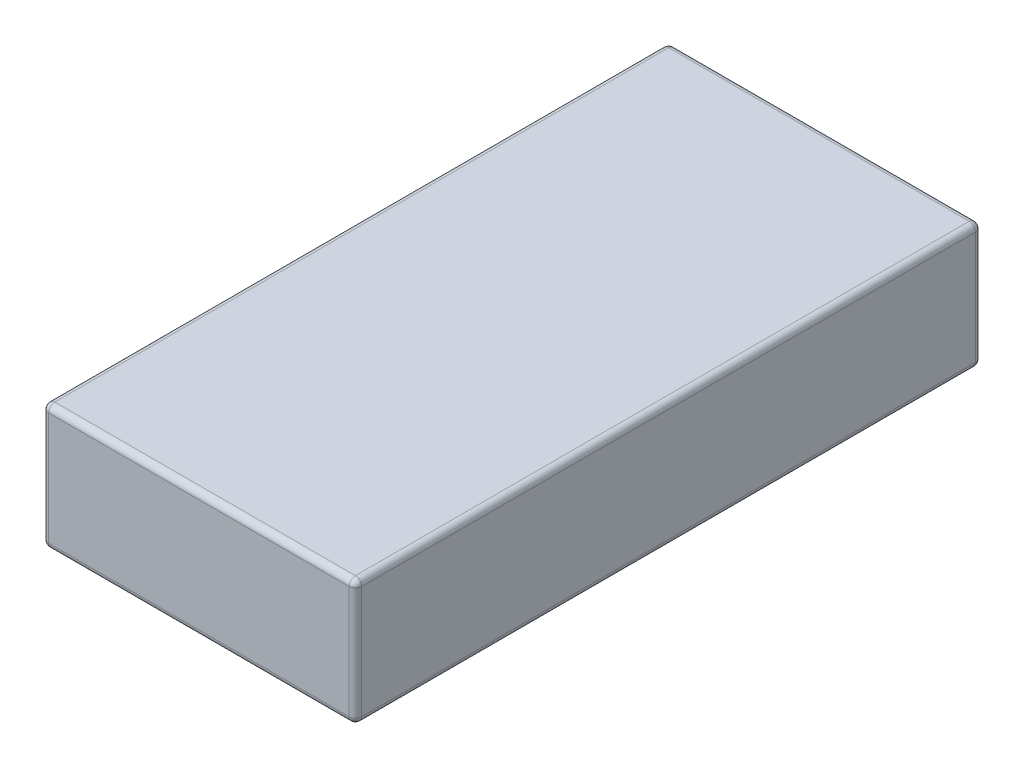
ISO-10303-21;
HEADER;
FILE_DESCRIPTION(('STEP AP214'),'2;1');
FILE_NAME('part.step','',(''),(''),'','','');
FILE_SCHEMA(('AUTOMOTIVE_DESIGN { 1 0 10303 214 1 1 1 1 }'));
ENDSEC;
DATA;
#1=APPLICATION_CONTEXT('core data for automotive mechanical design processes');
#2=APPLICATION_PROTOCOL_DEFINITION('international standard','automotive_design',2000,#1);
#3=PRODUCT_CONTEXT('',#1,'mechanical');
#4=PRODUCT('Part','Part','',(#3));
#5=PRODUCT_RELATED_PRODUCT_CATEGORY('part','',(#4));
#6=PRODUCT_DEFINITION_FORMATION('','',#4);
#7=PRODUCT_DEFINITION_CONTEXT('part definition',#1,'design');
#8=PRODUCT_DEFINITION('design','',#6,#7);
#9=PRODUCT_DEFINITION_SHAPE('','',#8);
#10=(LENGTH_UNIT() NAMED_UNIT(*) SI_UNIT(.MILLI.,.METRE.));
#11=(NAMED_UNIT(*) PLANE_ANGLE_UNIT() SI_UNIT($,.RADIAN.));
#12=(NAMED_UNIT(*) SI_UNIT($,.STERADIAN.) SOLID_ANGLE_UNIT());
#13=UNCERTAINTY_MEASURE_WITH_UNIT(LENGTH_MEASURE(1.E-05),#10,'distance_accuracy_value','');
#14=(GEOMETRIC_REPRESENTATION_CONTEXT(3) GLOBAL_UNCERTAINTY_ASSIGNED_CONTEXT((#13)) GLOBAL_UNIT_ASSIGNED_CONTEXT((#10,
#11,#12)) REPRESENTATION_CONTEXT('',''));
#15=CARTESIAN_POINT('',(0.,0.,0.));
#16=DIRECTION('',(0.,0.,1.));
#17=DIRECTION('',(1.,0.,0.));
#18=AXIS2_PLACEMENT_3D('',#15,#16,#17);
#19=CARTESIAN_POINT('',(2.5,2.,-5.));
#20=DIRECTION('',(-1.,0.,0.));
#21=DIRECTION('',(0.,0.,1.));
#22=AXIS2_PLACEMENT_3D('',#19,#20,#21);
#23=PLANE('',#22);
#24=DIRECTION('',(0.,-1.,0.));
#25=VECTOR('',#24,1.);
#26=CARTESIAN_POINT('',(2.5,2.,4.9));
#27=LINE('',#26,#25);
#28=CARTESIAN_POINT('',(2.5,1.9,4.9));
#29=VERTEX_POINT('',#28);
#30=CARTESIAN_POINT('',(2.5,0.1,4.9));
#31=VERTEX_POINT('',#30);
#32=EDGE_CURVE('E148',#29,#31,#27,.T.);
#33=ORIENTED_EDGE('',*,*,#32,.T.);
#34=DIRECTION('',(0.,0.,-1.));
#35=VECTOR('',#34,1.);
#36=CARTESIAN_POINT('',(2.5,0.1,-5.));
#37=LINE('',#36,#35);
#38=CARTESIAN_POINT('',(2.5,0.1,-4.9));
#39=VERTEX_POINT('',#38);
#40=EDGE_CURVE('E144',#31,#39,#37,.T.);
#41=ORIENTED_EDGE('',*,*,#40,.T.);
#42=DIRECTION('',(0.,-1.,0.));
#43=VECTOR('',#42,1.);
#44=CARTESIAN_POINT('',(2.5,2.,-4.9));
#45=LINE('',#44,#43);
#46=CARTESIAN_POINT('',(2.5,1.9,-4.9));
#47=VERTEX_POINT('',#46);
#48=EDGE_CURVE('E139',#39,#47,#45,.F.);
#49=ORIENTED_EDGE('',*,*,#48,.T.);
#50=DIRECTION('',(0.,0.,-1.));
#51=VECTOR('',#50,1.);
#52=CARTESIAN_POINT('',(2.5,1.9,5.));
#53=LINE('',#52,#51);
#54=EDGE_CURVE('E141',#47,#29,#53,.F.);
#55=ORIENTED_EDGE('',*,*,#54,.T.);
#56=EDGE_LOOP('',(#33,#41,#49,#55));
#57=FACE_BOUND('',#56,.T.);
#58=ADVANCED_FACE('F51',(#57),#23,.F.);
#59=CARTESIAN_POINT('',(-2.5,2.,-5.));
#60=DIRECTION('',(0.,0.,1.));
#61=DIRECTION('',(1.,0.,0.));
#62=AXIS2_PLACEMENT_3D('',#59,#60,#61);
#63=PLANE('',#62);
#64=DIRECTION('',(-1.,0.,0.));
#65=VECTOR('',#64,1.);
#66=CARTESIAN_POINT('',(2.5,1.9,-5.));
#67=LINE('',#66,#65);
#68=CARTESIAN_POINT('',(-2.4,1.9,-5.));
#69=VERTEX_POINT('',#68);
#70=CARTESIAN_POINT('',(2.4,1.9,-5.));
#71=VERTEX_POINT('',#70);
#72=EDGE_CURVE('E282',#69,#71,#67,.F.);
#73=ORIENTED_EDGE('',*,*,#72,.T.);
#74=DIRECTION('',(0.,-1.,0.));
#75=VECTOR('',#74,1.);
#76=CARTESIAN_POINT('',(2.4,2.,-5.));
#77=LINE('',#76,#75);
#78=CARTESIAN_POINT('',(2.4,0.1,-5.));
#79=VERTEX_POINT('',#78);
#80=EDGE_CURVE('E170',#71,#79,#77,.T.);
#81=ORIENTED_EDGE('',*,*,#80,.T.);
#82=DIRECTION('',(-1.,0.,0.));
#83=VECTOR('',#82,1.);
#84=CARTESIAN_POINT('',(-2.5,0.1,-5.));
#85=LINE('',#84,#83);
#86=CARTESIAN_POINT('',(-2.4,0.1,-5.));
#87=VERTEX_POINT('',#86);
#88=EDGE_CURVE('E290',#79,#87,#85,.T.);
#89=ORIENTED_EDGE('',*,*,#88,.T.);
#90=DIRECTION('',(0.,-1.,0.));
#91=VECTOR('',#90,1.);
#92=CARTESIAN_POINT('',(-2.4,2.,-5.));
#93=LINE('',#92,#91);
#94=EDGE_CURVE('E284',#87,#69,#93,.F.);
#95=ORIENTED_EDGE('',*,*,#94,.T.);
#96=EDGE_LOOP('',(#73,#81,#89,#95));
#97=FACE_BOUND('',#96,.T.);
#98=ADVANCED_FACE('F326',(#97),#63,.F.);
#99=CARTESIAN_POINT('',(-2.5,2.,-5.));
#100=DIRECTION('',(1.,0.,0.));
#101=DIRECTION('',(0.,0.,-1.));
#102=AXIS2_PLACEMENT_3D('',#99,#100,#101);
#103=PLANE('',#102);
#104=DIRECTION('',(0.,0.,1.));
#105=VECTOR('',#104,1.);
#106=CARTESIAN_POINT('',(-2.5,1.9,-5.));
#107=LINE('',#106,#105);
#108=CARTESIAN_POINT('',(-2.5,1.9,4.9));
#109=VERTEX_POINT('',#108);
#110=CARTESIAN_POINT('',(-2.5,1.9,-4.9));
#111=VERTEX_POINT('',#110);
#112=EDGE_CURVE('E293',#109,#111,#107,.F.);
#113=ORIENTED_EDGE('',*,*,#112,.T.);
#114=DIRECTION('',(0.,-1.,0.));
#115=VECTOR('',#114,1.);
#116=CARTESIAN_POINT('',(-2.5,2.,-4.9));
#117=LINE('',#116,#115);
#118=CARTESIAN_POINT('',(-2.5,0.1,-4.9));
#119=VERTEX_POINT('',#118);
#120=EDGE_CURVE('E298',#111,#119,#117,.T.);
#121=ORIENTED_EDGE('',*,*,#120,.T.);
#122=DIRECTION('',(0.,0.,1.));
#123=VECTOR('',#122,1.);
#124=CARTESIAN_POINT('',(-2.5,0.1,-5.));
#125=LINE('',#124,#123);
#126=CARTESIAN_POINT('',(-2.5,0.1,4.9));
#127=VERTEX_POINT('',#126);
#128=EDGE_CURVE('E296',#119,#127,#125,.T.);
#129=ORIENTED_EDGE('',*,*,#128,.T.);
#130=DIRECTION('',(0.,-1.,0.));
#131=VECTOR('',#130,1.);
#132=CARTESIAN_POINT('',(-2.5,2.,4.9));
#133=LINE('',#132,#131);
#134=EDGE_CURVE('E230',#127,#109,#133,.F.);
#135=ORIENTED_EDGE('',*,*,#134,.T.);
#136=EDGE_LOOP('',(#113,#121,#129,#135));
#137=FACE_BOUND('',#136,.T.);
#138=ADVANCED_FACE('F318',(#137),#103,.F.);
#139=CARTESIAN_POINT('',(-2.5,2.,5.));
#140=DIRECTION('',(0.,0.,-1.));
#141=DIRECTION('',(-1.,0.,0.));
#142=AXIS2_PLACEMENT_3D('',#139,#140,#141);
#143=PLANE('',#142);
#144=DIRECTION('',(0.,-1.,0.));
#145=VECTOR('',#144,1.);
#146=CARTESIAN_POINT('',(-2.4,2.,5.));
#147=LINE('',#146,#145);
#148=CARTESIAN_POINT('',(-2.4,1.9,5.));
#149=VERTEX_POINT('',#148);
#150=CARTESIAN_POINT('',(-2.4,0.1,5.));
#151=VERTEX_POINT('',#150);
#152=EDGE_CURVE('E233',#149,#151,#147,.T.);
#153=ORIENTED_EDGE('',*,*,#152,.T.);
#154=DIRECTION('',(1.,0.,0.));
#155=VECTOR('',#154,1.);
#156=CARTESIAN_POINT('',(-2.5,0.1,5.));
#157=LINE('',#156,#155);
#158=CARTESIAN_POINT('',(2.4,0.1,5.));
#159=VERTEX_POINT('',#158);
#160=EDGE_CURVE('E235',#151,#159,#157,.T.);
#161=ORIENTED_EDGE('',*,*,#160,.T.);
#162=DIRECTION('',(0.,-1.,0.));
#163=VECTOR('',#162,1.);
#164=CARTESIAN_POINT('',(2.4,2.,5.));
#165=LINE('',#164,#163);
#166=CARTESIAN_POINT('',(2.4,1.9,5.));
#167=VERTEX_POINT('',#166);
#168=EDGE_CURVE('E236',#159,#167,#165,.F.);
#169=ORIENTED_EDGE('',*,*,#168,.T.);
#170=DIRECTION('',(1.,0.,0.));
#171=VECTOR('',#170,1.);
#172=CARTESIAN_POINT('',(-2.5,1.9,5.));
#173=LINE('',#172,#171);
#174=EDGE_CURVE('E240',#167,#149,#173,.F.);
#175=ORIENTED_EDGE('',*,*,#174,.T.);
#176=EDGE_LOOP('',(#153,#161,#169,#175));
#177=FACE_BOUND('',#176,.T.);
#178=ADVANCED_FACE('F301',(#177),#143,.F.);
#179=CARTESIAN_POINT('',(0.,2.,0.));
#180=DIRECTION('',(0.,1.,0.));
#181=DIRECTION('',(0.,0.,1.));
#182=AXIS2_PLACEMENT_3D('',#179,#180,#181);
#183=PLANE('',#182);
#184=DIRECTION('',(0.,0.,1.));
#185=VECTOR('',#184,1.);
#186=CARTESIAN_POINT('',(-2.4,2.,5.));
#187=LINE('',#186,#185);
#188=CARTESIAN_POINT('',(-2.4,2.,-4.9));
#189=VERTEX_POINT('',#188);
#190=CARTESIAN_POINT('',(-2.4,2.,4.9));
#191=VERTEX_POINT('',#190);
#192=EDGE_CURVE('E60',#189,#191,#187,.T.);
#193=ORIENTED_EDGE('',*,*,#192,.T.);
#194=DIRECTION('',(1.,0.,0.));
#195=VECTOR('',#194,1.);
#196=CARTESIAN_POINT('',(2.5,2.,4.9));
#197=LINE('',#196,#195);
#198=CARTESIAN_POINT('',(2.4,2.,4.9));
#199=VERTEX_POINT('',#198);
#200=EDGE_CURVE('E11',#191,#199,#197,.T.);
#201=ORIENTED_EDGE('',*,*,#200,.T.);
#202=DIRECTION('',(0.,0.,-1.));
#203=VECTOR('',#202,1.);
#204=CARTESIAN_POINT('',(2.4,2.,-5.));
#205=LINE('',#204,#203);
#206=CARTESIAN_POINT('',(2.4,2.,-4.9));
#207=VERTEX_POINT('',#206);
#208=EDGE_CURVE('E238',#199,#207,#205,.T.);
#209=ORIENTED_EDGE('',*,*,#208,.T.);
#210=DIRECTION('',(-1.,0.,0.));
#211=VECTOR('',#210,1.);
#212=CARTESIAN_POINT('',(-2.5,2.,-4.9));
#213=LINE('',#212,#211);
#214=EDGE_CURVE('E71',#207,#189,#213,.T.);
#215=ORIENTED_EDGE('',*,*,#214,.T.);
#216=EDGE_LOOP('',(#193,#201,#209,#215));
#217=FACE_BOUND('',#216,.T.);
#218=ADVANCED_FACE('F306',(#217),#183,.T.);
#219=CARTESIAN_POINT('',(0.,0.,0.));
#220=DIRECTION('',(0.,1.,0.));
#221=DIRECTION('',(0.,0.,1.));
#222=AXIS2_PLACEMENT_3D('',#219,#220,#221);
#223=PLANE('',#222);
#224=DIRECTION('',(-1.,0.,0.));
#225=VECTOR('',#224,1.);
#226=CARTESIAN_POINT('',(0.,0.,-4.9));
#227=LINE('',#226,#225);
#228=CARTESIAN_POINT('',(-2.4,0.,-4.9));
#229=VERTEX_POINT('',#228);
#230=CARTESIAN_POINT('',(2.4,0.,-4.9));
#231=VERTEX_POINT('',#230);
#232=EDGE_CURVE('E278',#229,#231,#227,.F.);
#233=ORIENTED_EDGE('',*,*,#232,.T.);
#234=DIRECTION('',(0.,0.,-1.));
#235=VECTOR('',#234,1.);
#236=CARTESIAN_POINT('',(2.4,0.,0.));
#237=LINE('',#236,#235);
#238=CARTESIAN_POINT('',(2.4,0.,4.9));
#239=VERTEX_POINT('',#238);
#240=EDGE_CURVE('E275',#231,#239,#237,.F.);
#241=ORIENTED_EDGE('',*,*,#240,.T.);
#242=DIRECTION('',(1.,0.,0.));
#243=VECTOR('',#242,1.);
#244=CARTESIAN_POINT('',(0.,0.,4.9));
#245=LINE('',#244,#243);
#246=CARTESIAN_POINT('',(-2.4,0.,4.9));
#247=VERTEX_POINT('',#246);
#248=EDGE_CURVE('E266',#239,#247,#245,.F.);
#249=ORIENTED_EDGE('',*,*,#248,.T.);
#250=DIRECTION('',(0.,0.,1.));
#251=VECTOR('',#250,1.);
#252=CARTESIAN_POINT('',(-2.4,0.,0.));
#253=LINE('',#252,#251);
#254=EDGE_CURVE('E272',#247,#229,#253,.F.);
#255=ORIENTED_EDGE('',*,*,#254,.T.);
#256=EDGE_LOOP('',(#233,#241,#249,#255));
#257=FACE_BOUND('',#256,.T.);
#258=ADVANCED_FACE('F276',(#257),#223,.F.);
#259=CARTESIAN_POINT('',(-2.4,1.9,0.));
#260=DIRECTION('',(0.,0.,-1.));
#261=DIRECTION('',(-1.,0.,0.));
#262=AXIS2_PLACEMENT_3D('',#259,#260,#261);
#263=CYLINDRICAL_SURFACE('',#262,0.1);
#264=CARTESIAN_POINT('',(-2.4,1.9,4.9));
#265=DIRECTION('',(0.,0.,1.));
#266=DIRECTION('',(1.,0.,0.));
#267=AXIS2_PLACEMENT_3D('',#264,#265,#266);
#268=CIRCLE('',#267,0.1);
#269=EDGE_CURVE('E55',#191,#109,#268,.T.);
#270=ORIENTED_EDGE('',*,*,#269,.F.);
#271=ORIENTED_EDGE('',*,*,#192,.F.);
#272=CARTESIAN_POINT('',(-2.4,1.9,-4.9));
#273=DIRECTION('',(0.,0.,-1.));
#274=DIRECTION('',(-1.,0.,0.));
#275=AXIS2_PLACEMENT_3D('',#272,#273,#274);
#276=CIRCLE('',#275,0.1);
#277=EDGE_CURVE('E211',#111,#189,#276,.T.);
#278=ORIENTED_EDGE('',*,*,#277,.F.);
#279=ORIENTED_EDGE('',*,*,#112,.F.);
#280=EDGE_LOOP('',(#270,#271,#278,#279));
#281=FACE_BOUND('',#280,.T.);
#282=ADVANCED_FACE('F53',(#281),#263,.T.);
#283=CARTESIAN_POINT('',(-2.4,1.9,4.9));
#284=DIRECTION('',(-1.,0.,0.));
#285=DIRECTION('',(0.,0.,1.));
#286=AXIS2_PLACEMENT_3D('',#283,#284,#285);
#287=SPHERICAL_SURFACE('',#286,0.1);
#288=CARTESIAN_POINT('',(-2.4,1.9,4.9));
#289=DIRECTION('',(-1.,0.,0.));
#290=DIRECTION('',(0.,0.,1.));
#291=AXIS2_PLACEMENT_3D('',#288,#289,#290);
#292=CIRCLE('',#291,0.1);
#293=EDGE_CURVE('E206',#191,#149,#292,.F.);
#294=ORIENTED_EDGE('',*,*,#293,.F.);
#295=ORIENTED_EDGE('',*,*,#269,.T.);
#296=CARTESIAN_POINT('',(-2.4,1.9,4.9));
#297=DIRECTION('',(0.,1.,0.));
#298=DIRECTION('',(0.,0.,1.));
#299=AXIS2_PLACEMENT_3D('',#296,#297,#298);
#300=CIRCLE('',#299,0.1);
#301=EDGE_CURVE('E209',#149,#109,#300,.F.);
#302=ORIENTED_EDGE('',*,*,#301,.F.);
#303=EDGE_LOOP('',(#294,#295,#302));
#304=FACE_BOUND('',#303,.T.);
#305=ADVANCED_FACE('F221',(#304),#287,.T.);
#306=CARTESIAN_POINT('',(-2.4,1.9,-4.9));
#307=DIRECTION('',(0.,1.,0.));
#308=DIRECTION('',(0.,0.,1.));
#309=AXIS2_PLACEMENT_3D('',#306,#307,#308);
#310=SPHERICAL_SURFACE('',#309,0.1);
#311=CARTESIAN_POINT('',(-2.4,1.9,-4.9));
#312=DIRECTION('',(0.,1.,0.));
#313=DIRECTION('',(0.,0.,1.));
#314=AXIS2_PLACEMENT_3D('',#311,#312,#313);
#315=CIRCLE('',#314,0.1);
#316=EDGE_CURVE('E200',#111,#69,#315,.F.);
#317=ORIENTED_EDGE('',*,*,#316,.F.);
#318=ORIENTED_EDGE('',*,*,#277,.T.);
#319=CARTESIAN_POINT('',(-2.4,1.9,-4.9));
#320=DIRECTION('',(-1.,0.,0.));
#321=DIRECTION('',(0.,0.,1.));
#322=AXIS2_PLACEMENT_3D('',#319,#320,#321);
#323=CIRCLE('',#322,0.1);
#324=EDGE_CURVE('E203',#69,#189,#323,.F.);
#325=ORIENTED_EDGE('',*,*,#324,.F.);
#326=EDGE_LOOP('',(#317,#318,#325));
#327=FACE_BOUND('',#326,.T.);
#328=ADVANCED_FACE('F310',(#327),#310,.T.);
#329=CARTESIAN_POINT('',(-2.4,2.,4.9));
#330=DIRECTION('',(0.,-1.,0.));
#331=DIRECTION('',(0.,0.,-1.));
#332=AXIS2_PLACEMENT_3D('',#329,#330,#331);
#333=CYLINDRICAL_SURFACE('',#332,0.1);
#334=ORIENTED_EDGE('',*,*,#301,.T.);
#335=ORIENTED_EDGE('',*,*,#134,.F.);
#336=CARTESIAN_POINT('',(-2.4,0.1,4.9));
#337=DIRECTION('',(0.,-1.,0.));
#338=DIRECTION('',(0.,0.,-1.));
#339=AXIS2_PLACEMENT_3D('',#336,#337,#338);
#340=CIRCLE('',#339,0.1);
#341=EDGE_CURVE('E194',#151,#127,#340,.T.);
#342=ORIENTED_EDGE('',*,*,#341,.F.);
#343=ORIENTED_EDGE('',*,*,#152,.F.);
#344=EDGE_LOOP('',(#334,#335,#342,#343));
#345=FACE_BOUND('',#344,.T.);
#346=ADVANCED_FACE('F228',(#345),#333,.T.);
#347=CARTESIAN_POINT('',(0.,1.9,4.9));
#348=DIRECTION('',(-1.,0.,0.));
#349=DIRECTION('',(0.,0.,1.));
#350=AXIS2_PLACEMENT_3D('',#347,#348,#349);
#351=CYLINDRICAL_SURFACE('',#350,0.1);
#352=ORIENTED_EDGE('',*,*,#293,.T.);
#353=ORIENTED_EDGE('',*,*,#174,.F.);
#354=CARTESIAN_POINT('',(2.4,1.9,4.9));
#355=DIRECTION('',(1.,0.,0.));
#356=DIRECTION('',(0.,0.,-1.));
#357=AXIS2_PLACEMENT_3D('',#354,#355,#356);
#358=CIRCLE('',#357,0.1);
#359=EDGE_CURVE('E191',#199,#167,#358,.T.);
#360=ORIENTED_EDGE('',*,*,#359,.F.);
#361=ORIENTED_EDGE('',*,*,#200,.F.);
#362=EDGE_LOOP('',(#352,#353,#360,#361));
#363=FACE_BOUND('',#362,.T.);
#364=ADVANCED_FACE('F305',(#363),#351,.T.);
#365=CARTESIAN_POINT('',(2.4,1.9,0.));
#366=DIRECTION('',(0.,0.,1.));
#367=DIRECTION('',(1.,0.,0.));
#368=AXIS2_PLACEMENT_3D('',#365,#366,#367);
#369=CYLINDRICAL_SURFACE('',#368,0.1);
#370=CARTESIAN_POINT('',(2.4,1.9,-4.9));
#371=DIRECTION('',(0.,0.,-1.));
#372=DIRECTION('',(-1.,0.,0.));
#373=AXIS2_PLACEMENT_3D('',#370,#371,#372);
#374=CIRCLE('',#373,0.1);
#375=EDGE_CURVE('E155',#207,#47,#374,.T.);
#376=ORIENTED_EDGE('',*,*,#375,.F.);
#377=ORIENTED_EDGE('',*,*,#208,.F.);
#378=CARTESIAN_POINT('',(2.4,1.9,4.9));
#379=DIRECTION('',(0.,0.,1.));
#380=DIRECTION('',(0.,-1.,0.));
#381=AXIS2_PLACEMENT_3D('',#378,#379,#380);
#382=CIRCLE('',#381,0.1);
#383=EDGE_CURVE('E157',#29,#199,#382,.T.);
#384=ORIENTED_EDGE('',*,*,#383,.F.);
#385=ORIENTED_EDGE('',*,*,#54,.F.);
#386=EDGE_LOOP('',(#376,#377,#384,#385));
#387=FACE_BOUND('',#386,.T.);
#388=ADVANCED_FACE('F153',(#387),#369,.T.);
#389=CARTESIAN_POINT('',(0.,1.9,-4.9));
#390=DIRECTION('',(1.,0.,0.));
#391=DIRECTION('',(0.,0.,-1.));
#392=AXIS2_PLACEMENT_3D('',#389,#390,#391);
#393=CYLINDRICAL_SURFACE('',#392,0.1);
#394=ORIENTED_EDGE('',*,*,#324,.T.);
#395=ORIENTED_EDGE('',*,*,#214,.F.);
#396=CARTESIAN_POINT('',(2.4,1.9,-4.9));
#397=DIRECTION('',(1.,0.,0.));
#398=DIRECTION('',(0.,1.,0.));
#399=AXIS2_PLACEMENT_3D('',#396,#397,#398);
#400=CIRCLE('',#399,0.1);
#401=EDGE_CURVE('E166',#71,#207,#400,.T.);
#402=ORIENTED_EDGE('',*,*,#401,.F.);
#403=ORIENTED_EDGE('',*,*,#72,.F.);
#404=EDGE_LOOP('',(#394,#395,#402,#403));
#405=FACE_BOUND('',#404,.T.);
#406=ADVANCED_FACE('F308',(#405),#393,.T.);
#407=CARTESIAN_POINT('',(-2.4,2.,-4.9));
#408=DIRECTION('',(0.,-1.,0.));
#409=DIRECTION('',(0.,0.,-1.));
#410=AXIS2_PLACEMENT_3D('',#407,#408,#409);
#411=CYLINDRICAL_SURFACE('',#410,0.1);
#412=ORIENTED_EDGE('',*,*,#316,.T.);
#413=ORIENTED_EDGE('',*,*,#94,.F.);
#414=CARTESIAN_POINT('',(-2.4,0.1,-4.9));
#415=DIRECTION('',(0.,-1.,0.));
#416=DIRECTION('',(0.,0.,-1.));
#417=AXIS2_PLACEMENT_3D('',#414,#415,#416);
#418=CIRCLE('',#417,0.1);
#419=EDGE_CURVE('E186',#119,#87,#418,.T.);
#420=ORIENTED_EDGE('',*,*,#419,.F.);
#421=ORIENTED_EDGE('',*,*,#120,.F.);
#422=EDGE_LOOP('',(#412,#413,#420,#421));
#423=FACE_BOUND('',#422,.T.);
#424=ADVANCED_FACE('F315',(#423),#411,.T.);
#425=CARTESIAN_POINT('',(-2.4,0.1,-5.));
#426=DIRECTION('',(0.,0.,1.));
#427=DIRECTION('',(1.,0.,0.));
#428=AXIS2_PLACEMENT_3D('',#425,#426,#427);
#429=CYLINDRICAL_SURFACE('',#428,0.1);
#430=CARTESIAN_POINT('',(-2.4,0.1,4.9));
#431=DIRECTION('',(0.,0.,1.));
#432=DIRECTION('',(1.,0.,0.));
#433=AXIS2_PLACEMENT_3D('',#430,#431,#432);
#434=CIRCLE('',#433,0.1);
#435=EDGE_CURVE('E197',#127,#247,#434,.T.);
#436=ORIENTED_EDGE('',*,*,#435,.F.);
#437=ORIENTED_EDGE('',*,*,#128,.F.);
#438=CARTESIAN_POINT('',(-2.4,0.1,-4.9));
#439=DIRECTION('',(0.,0.,-1.));
#440=DIRECTION('',(-1.,0.,0.));
#441=AXIS2_PLACEMENT_3D('',#438,#439,#440);
#442=CIRCLE('',#441,0.1);
#443=EDGE_CURVE('E184',#229,#119,#442,.T.);
#444=ORIENTED_EDGE('',*,*,#443,.F.);
#445=ORIENTED_EDGE('',*,*,#254,.F.);
#446=EDGE_LOOP('',(#436,#437,#444,#445));
#447=FACE_BOUND('',#446,.T.);
#448=ADVANCED_FACE('F369',(#447),#429,.T.);
#449=CARTESIAN_POINT('',(-2.4,0.1,4.9));
#450=DIRECTION('',(-1.,0.,0.));
#451=DIRECTION('',(0.,-1.,0.));
#452=AXIS2_PLACEMENT_3D('',#449,#450,#451);
#453=SPHERICAL_SURFACE('',#452,0.1);
#454=ORIENTED_EDGE('',*,*,#341,.T.);
#455=ORIENTED_EDGE('',*,*,#435,.T.);
#456=CARTESIAN_POINT('',(-2.4,0.1,4.9));
#457=DIRECTION('',(-1.,0.,0.));
#458=DIRECTION('',(0.,0.,1.));
#459=AXIS2_PLACEMENT_3D('',#456,#457,#458);
#460=CIRCLE('',#459,0.1);
#461=EDGE_CURVE('E175',#151,#247,#460,.F.);
#462=ORIENTED_EDGE('',*,*,#461,.F.);
#463=EDGE_LOOP('',(#454,#455,#462));
#464=FACE_BOUND('',#463,.T.);
#465=ADVANCED_FACE('F365',(#464),#453,.T.);
#466=CARTESIAN_POINT('',(2.4,1.9,4.9));
#467=DIRECTION('',(0.,1.,0.));
#468=DIRECTION('',(0.,0.,1.));
#469=AXIS2_PLACEMENT_3D('',#466,#467,#468);
#470=SPHERICAL_SURFACE('',#469,0.1);
#471=ORIENTED_EDGE('',*,*,#383,.T.);
#472=ORIENTED_EDGE('',*,*,#359,.T.);
#473=CARTESIAN_POINT('',(2.4,1.9,4.9));
#474=DIRECTION('',(0.,1.,0.));
#475=DIRECTION('',(0.,0.,1.));
#476=AXIS2_PLACEMENT_3D('',#473,#474,#475);
#477=CIRCLE('',#476,0.1);
#478=EDGE_CURVE('E171',#29,#167,#477,.F.);
#479=ORIENTED_EDGE('',*,*,#478,.F.);
#480=EDGE_LOOP('',(#471,#472,#479));
#481=FACE_BOUND('',#480,.T.);
#482=ADVANCED_FACE('F362',(#481),#470,.T.);
#483=CARTESIAN_POINT('',(2.4,1.9,-4.9));
#484=DIRECTION('',(0.,1.,0.));
#485=DIRECTION('',(0.,0.,1.));
#486=AXIS2_PLACEMENT_3D('',#483,#484,#485);
#487=SPHERICAL_SURFACE('',#486,0.1);
#488=ORIENTED_EDGE('',*,*,#401,.T.);
#489=ORIENTED_EDGE('',*,*,#375,.T.);
#490=CARTESIAN_POINT('',(2.4,1.9,-4.9));
#491=DIRECTION('',(0.,1.,0.));
#492=DIRECTION('',(0.,0.,1.));
#493=AXIS2_PLACEMENT_3D('',#490,#491,#492);
#494=CIRCLE('',#493,0.1);
#495=EDGE_CURVE('E163',#71,#47,#494,.F.);
#496=ORIENTED_EDGE('',*,*,#495,.F.);
#497=EDGE_LOOP('',(#488,#489,#496));
#498=FACE_BOUND('',#497,.T.);
#499=ADVANCED_FACE('F162',(#498),#487,.T.);
#500=CARTESIAN_POINT('',(-2.4,0.1,-4.9));
#501=DIRECTION('',(-1.,0.,0.));
#502=DIRECTION('',(0.,-1.,0.));
#503=AXIS2_PLACEMENT_3D('',#500,#501,#502);
#504=SPHERICAL_SURFACE('',#503,0.1);
#505=ORIENTED_EDGE('',*,*,#443,.T.);
#506=ORIENTED_EDGE('',*,*,#419,.T.);
#507=CARTESIAN_POINT('',(-2.4,0.1,-4.9));
#508=DIRECTION('',(-1.,0.,0.));
#509=DIRECTION('',(0.,0.,1.));
#510=AXIS2_PLACEMENT_3D('',#507,#508,#509);
#511=CIRCLE('',#510,0.1);
#512=EDGE_CURVE('E172',#229,#87,#511,.F.);
#513=ORIENTED_EDGE('',*,*,#512,.F.);
#514=EDGE_LOOP('',(#505,#506,#513));
#515=FACE_BOUND('',#514,.T.);
#516=ADVANCED_FACE('F356',(#515),#504,.T.);
#517=CARTESIAN_POINT('',(-2.5,0.1,4.9));
#518=DIRECTION('',(1.,0.,0.));
#519=DIRECTION('',(0.,0.,-1.));
#520=AXIS2_PLACEMENT_3D('',#517,#518,#519);
#521=CYLINDRICAL_SURFACE('',#520,0.1);
#522=ORIENTED_EDGE('',*,*,#461,.T.);
#523=ORIENTED_EDGE('',*,*,#248,.F.);
#524=CARTESIAN_POINT('',(2.4,0.1,4.9));
#525=DIRECTION('',(1.,0.,0.));
#526=DIRECTION('',(0.,0.,-1.));
#527=AXIS2_PLACEMENT_3D('',#524,#525,#526);
#528=CIRCLE('',#527,0.1);
#529=EDGE_CURVE('E178',#159,#239,#528,.T.);
#530=ORIENTED_EDGE('',*,*,#529,.F.);
#531=ORIENTED_EDGE('',*,*,#160,.F.);
#532=EDGE_LOOP('',(#522,#523,#530,#531));
#533=FACE_BOUND('',#532,.T.);
#534=ADVANCED_FACE('F268',(#533),#521,.T.);
#535=CARTESIAN_POINT('',(2.4,2.,4.9));
#536=DIRECTION('',(0.,-1.,0.));
#537=DIRECTION('',(0.,0.,-1.));
#538=AXIS2_PLACEMENT_3D('',#535,#536,#537);
#539=CYLINDRICAL_SURFACE('',#538,0.1);
#540=ORIENTED_EDGE('',*,*,#478,.T.);
#541=ORIENTED_EDGE('',*,*,#168,.F.);
#542=CARTESIAN_POINT('',(2.4,0.1,4.9));
#543=DIRECTION('',(0.,-1.,0.));
#544=DIRECTION('',(0.,0.,-1.));
#545=AXIS2_PLACEMENT_3D('',#542,#543,#544);
#546=CIRCLE('',#545,0.1);
#547=EDGE_CURVE('E256',#31,#159,#546,.T.);
#548=ORIENTED_EDGE('',*,*,#547,.F.);
#549=ORIENTED_EDGE('',*,*,#32,.F.);
#550=EDGE_LOOP('',(#540,#541,#548,#549));
#551=FACE_BOUND('',#550,.T.);
#552=ADVANCED_FACE('F350',(#551),#539,.T.);
#553=CARTESIAN_POINT('',(2.4,2.,-4.9));
#554=DIRECTION('',(0.,-1.,0.));
#555=DIRECTION('',(0.,0.,-1.));
#556=AXIS2_PLACEMENT_3D('',#553,#554,#555);
#557=CYLINDRICAL_SURFACE('',#556,0.1);
#558=ORIENTED_EDGE('',*,*,#495,.T.);
#559=ORIENTED_EDGE('',*,*,#48,.F.);
#560=CARTESIAN_POINT('',(2.4,0.1,-4.9));
#561=DIRECTION('',(0.,-1.,0.));
#562=DIRECTION('',(0.,0.,-1.));
#563=AXIS2_PLACEMENT_3D('',#560,#561,#562);
#564=CIRCLE('',#563,0.1);
#565=EDGE_CURVE('E253',#79,#39,#564,.T.);
#566=ORIENTED_EDGE('',*,*,#565,.F.);
#567=ORIENTED_EDGE('',*,*,#80,.F.);
#568=EDGE_LOOP('',(#558,#559,#566,#567));
#569=FACE_BOUND('',#568,.T.);
#570=ADVANCED_FACE('F168',(#569),#557,.T.);
#571=CARTESIAN_POINT('',(-2.5,0.1,-4.9));
#572=DIRECTION('',(-1.,0.,0.));
#573=DIRECTION('',(0.,0.,1.));
#574=AXIS2_PLACEMENT_3D('',#571,#572,#573);
#575=CYLINDRICAL_SURFACE('',#574,0.1);
#576=ORIENTED_EDGE('',*,*,#512,.T.);
#577=ORIENTED_EDGE('',*,*,#88,.F.);
#578=CARTESIAN_POINT('',(2.4,0.1,-4.9));
#579=DIRECTION('',(1.,0.,0.));
#580=DIRECTION('',(0.,0.,-1.));
#581=AXIS2_PLACEMENT_3D('',#578,#579,#580);
#582=CIRCLE('',#581,0.1);
#583=EDGE_CURVE('E251',#231,#79,#582,.T.);
#584=ORIENTED_EDGE('',*,*,#583,.F.);
#585=ORIENTED_EDGE('',*,*,#232,.F.);
#586=EDGE_LOOP('',(#576,#577,#584,#585));
#587=FACE_BOUND('',#586,.T.);
#588=ADVANCED_FACE('F344',(#587),#575,.T.);
#589=CARTESIAN_POINT('',(2.4,0.1,4.9));
#590=DIRECTION('',(0.,0.,1.));
#591=DIRECTION('',(0.,-1.,0.));
#592=AXIS2_PLACEMENT_3D('',#589,#590,#591);
#593=SPHERICAL_SURFACE('',#592,0.1);
#594=ORIENTED_EDGE('',*,*,#547,.T.);
#595=ORIENTED_EDGE('',*,*,#529,.T.);
#596=CARTESIAN_POINT('',(2.4,0.1,4.9));
#597=DIRECTION('',(0.,0.,1.));
#598=DIRECTION('',(1.,0.,0.));
#599=AXIS2_PLACEMENT_3D('',#596,#597,#598);
#600=CIRCLE('',#599,0.1);
#601=EDGE_CURVE('E249',#31,#239,#600,.F.);
#602=ORIENTED_EDGE('',*,*,#601,.F.);
#603=EDGE_LOOP('',(#594,#595,#602));
#604=FACE_BOUND('',#603,.T.);
#605=ADVANCED_FACE('F263',(#604),#593,.T.);
#606=CARTESIAN_POINT('',(2.4,0.1,-4.9));
#607=DIRECTION('',(0.,0.,-1.));
#608=DIRECTION('',(-1.,0.,0.));
#609=AXIS2_PLACEMENT_3D('',#606,#607,#608);
#610=SPHERICAL_SURFACE('',#609,0.1);
#611=ORIENTED_EDGE('',*,*,#583,.T.);
#612=ORIENTED_EDGE('',*,*,#565,.T.);
#613=CARTESIAN_POINT('',(2.4,0.1,-4.9));
#614=DIRECTION('',(0.,0.,-1.));
#615=DIRECTION('',(-1.,0.,0.));
#616=AXIS2_PLACEMENT_3D('',#613,#614,#615);
#617=CIRCLE('',#616,0.1);
#618=EDGE_CURVE('E247',#231,#39,#617,.F.);
#619=ORIENTED_EDGE('',*,*,#618,.F.);
#620=EDGE_LOOP('',(#611,#612,#619));
#621=FACE_BOUND('',#620,.T.);
#622=ADVANCED_FACE('F338',(#621),#610,.T.);
#623=CARTESIAN_POINT('',(2.4,0.1,-5.));
#624=DIRECTION('',(0.,0.,-1.));
#625=DIRECTION('',(-1.,0.,0.));
#626=AXIS2_PLACEMENT_3D('',#623,#624,#625);
#627=CYLINDRICAL_SURFACE('',#626,0.1);
#628=ORIENTED_EDGE('',*,*,#601,.T.);
#629=ORIENTED_EDGE('',*,*,#240,.F.);
#630=ORIENTED_EDGE('',*,*,#618,.T.);
#631=ORIENTED_EDGE('',*,*,#40,.F.);
#632=EDGE_LOOP('',(#628,#629,#630,#631));
#633=FACE_BOUND('',#632,.T.);
#634=ADVANCED_FACE('F335',(#633),#627,.T.);
#635=CLOSED_SHELL('',(#58,#98,#138,#178,#218,#258,#282,#305,#328,#346,#364,#388,#406,#424,#448,
#465,#482,#499,#516,#534,#552,#570,#588,#605,#622,#634));
#636=MANIFOLD_SOLID_BREP('B2',#635);
#637=ADVANCED_BREP_SHAPE_REPRESENTATION('',(#18,#636),#14);
#638=SHAPE_DEFINITION_REPRESENTATION(#9,#637);
ENDSEC;
END-ISO-10303-21;
